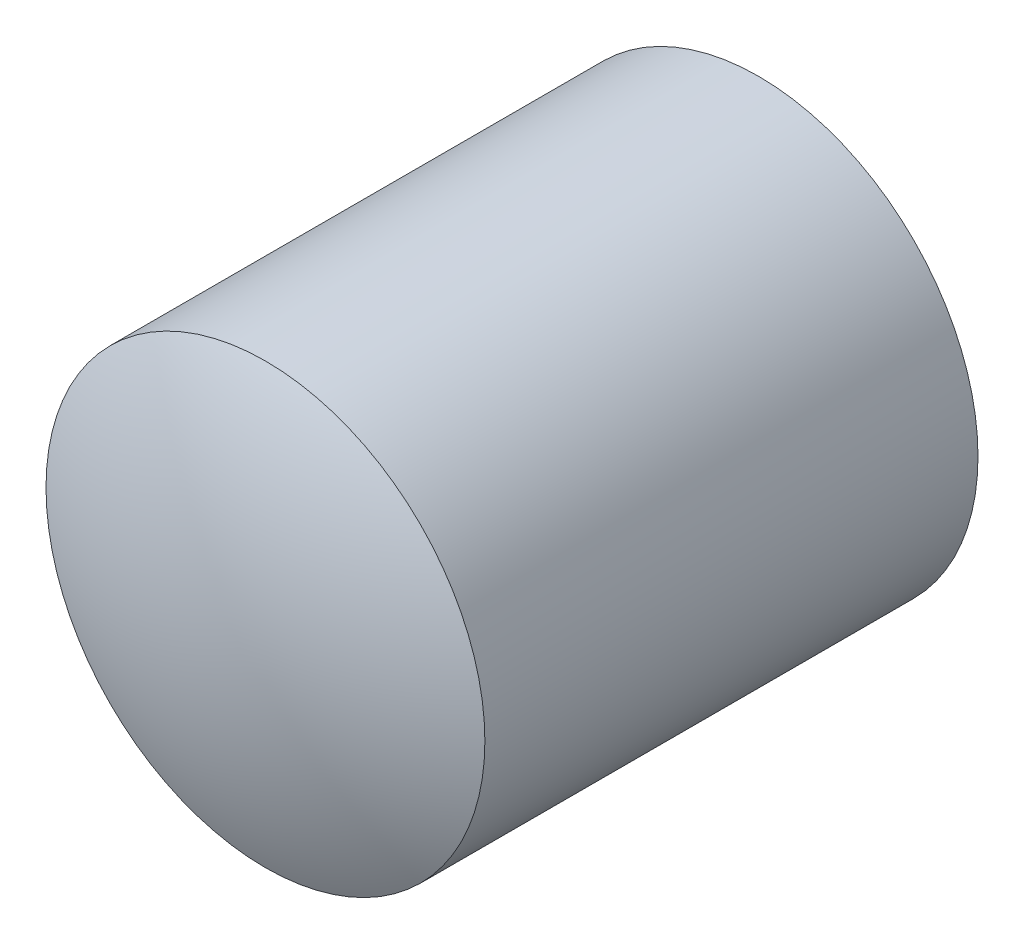
ISO-10303-21;
HEADER;
FILE_DESCRIPTION(('STEP AP214'),'2;1');
FILE_NAME('part.step','',(''),(''),'','','');
FILE_SCHEMA(('AUTOMOTIVE_DESIGN { 1 0 10303 214 1 1 1 1 }'));
ENDSEC;
DATA;
#1=APPLICATION_CONTEXT('core data for automotive mechanical design processes');
#2=APPLICATION_PROTOCOL_DEFINITION('international standard','automotive_design',2000,#1);
#3=PRODUCT_CONTEXT('',#1,'mechanical');
#4=PRODUCT('Part','Part','',(#3));
#5=PRODUCT_RELATED_PRODUCT_CATEGORY('part','',(#4));
#6=PRODUCT_DEFINITION_FORMATION('','',#4);
#7=PRODUCT_DEFINITION_CONTEXT('part definition',#1,'design');
#8=PRODUCT_DEFINITION('design','',#6,#7);
#9=PRODUCT_DEFINITION_SHAPE('','',#8);
#10=(LENGTH_UNIT() NAMED_UNIT(*) SI_UNIT(.MILLI.,.METRE.));
#11=(NAMED_UNIT(*) PLANE_ANGLE_UNIT() SI_UNIT($,.RADIAN.));
#12=(NAMED_UNIT(*) SI_UNIT($,.STERADIAN.) SOLID_ANGLE_UNIT());
#13=UNCERTAINTY_MEASURE_WITH_UNIT(LENGTH_MEASURE(1.E-05),#10,'distance_accuracy_value','');
#14=(GEOMETRIC_REPRESENTATION_CONTEXT(3) GLOBAL_UNCERTAINTY_ASSIGNED_CONTEXT((#13)) GLOBAL_UNIT_ASSIGNED_CONTEXT((#10,
#11,#12)) REPRESENTATION_CONTEXT('',''));
#15=CARTESIAN_POINT('',(0.,0.,0.));
#16=DIRECTION('',(0.,0.,1.));
#17=DIRECTION('',(1.,0.,0.));
#18=AXIS2_PLACEMENT_3D('',#15,#16,#17);
#19=CARTESIAN_POINT('',(0.,0.,2.60387424535613));
#20=DIRECTION('',(0.,0.,-1.));
#21=DIRECTION('',(0.,-1.,0.));
#22=AXIS2_PLACEMENT_3D('',#19,#20,#21);
#23=SPHERICAL_SURFACE('',#22,6.276);
#24=CARTESIAN_POINT('',(0.,0.,-3.053274));
#25=DIRECTION('',(0.,0.,-1.));
#26=DIRECTION('',(0.,1.,0.));
#27=AXIS2_PLACEMENT_3D('',#24,#25,#26);
#28=CIRCLE('',#27,2.717508);
#29=CARTESIAN_POINT('',(0.,2.717508,-3.053274));
#30=VERTEX_POINT('',#29);
#31=EDGE_CURVE('E10',#30,#30,#28,.T.);
#32=ORIENTED_EDGE('',*,*,#31,.T.);
#33=EDGE_LOOP('',(#32));
#34=FACE_BOUND('',#33,.T.);
#35=ADVANCED_FACE('F41',(#34),#23,.T.);
#36=CARTESIAN_POINT('',(0.,0.,0.));
#37=DIRECTION('',(0.,0.,-1.));
#38=DIRECTION('',(0.,1.,0.));
#39=AXIS2_PLACEMENT_3D('',#36,#37,#38);
#40=CYLINDRICAL_SURFACE('',#39,2.717508);
#41=ORIENTED_EDGE('',*,*,#31,.F.);
#42=EDGE_LOOP('',(#41));
#43=FACE_BOUND('',#42,.T.);
#44=CARTESIAN_POINT('',(0.,0.,3.053274));
#45=DIRECTION('',(0.,0.,-1.));
#46=DIRECTION('',(0.,1.,0.));
#47=AXIS2_PLACEMENT_3D('',#44,#45,#46);
#48=CIRCLE('',#47,2.717508);
#49=CARTESIAN_POINT('',(0.,2.717508,3.053274));
#50=VERTEX_POINT('',#49);
#51=EDGE_CURVE('E47',#50,#50,#48,.T.);
#52=ORIENTED_EDGE('',*,*,#51,.T.);
#53=EDGE_LOOP('',(#52));
#54=FACE_BOUND('',#53,.T.);
#55=ADVANCED_FACE('F53',(#43,#54),#40,.T.);
#56=CARTESIAN_POINT('',(0.,0.,-2.60387424535613));
#57=DIRECTION('',(0.,0.,-1.));
#58=DIRECTION('',(0.,1.,0.));
#59=AXIS2_PLACEMENT_3D('',#56,#57,#58);
#60=SPHERICAL_SURFACE('',#59,6.276);
#61=ORIENTED_EDGE('',*,*,#51,.F.);
#62=EDGE_LOOP('',(#61));
#63=FACE_BOUND('',#62,.T.);
#64=ADVANCED_FACE('F55',(#63),#60,.T.);
#65=CLOSED_SHELL('',(#35,#55,#64));
#66=MANIFOLD_SOLID_BREP('B2',#65);
#67=ADVANCED_BREP_SHAPE_REPRESENTATION('',(#18,#66),#14);
#68=SHAPE_DEFINITION_REPRESENTATION(#9,#67);
ENDSEC;
END-ISO-10303-21;
